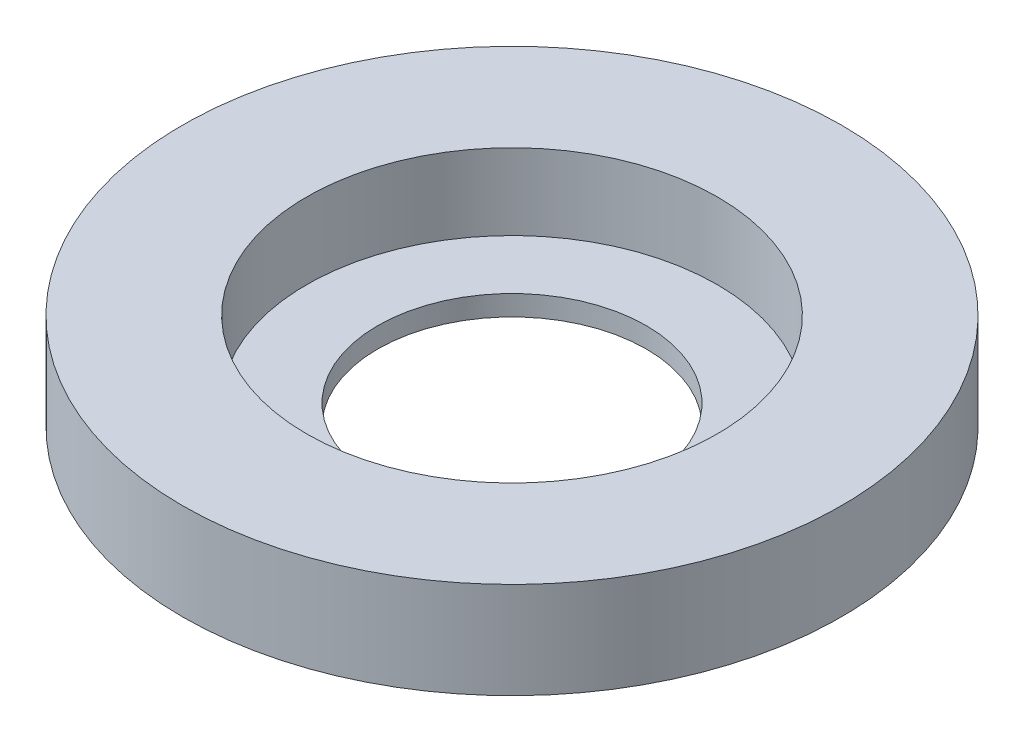
ISO-10303-21;
HEADER;
FILE_DESCRIPTION(('STEP AP214'),'2;1');
FILE_NAME('part.step','',(''),(''),'','','');
FILE_SCHEMA(('AUTOMOTIVE_DESIGN { 1 0 10303 214 1 1 1 1 }'));
ENDSEC;
DATA;
#1=APPLICATION_CONTEXT('core data for automotive mechanical design processes');
#2=APPLICATION_PROTOCOL_DEFINITION('international standard','automotive_design',2000,#1);
#3=PRODUCT_CONTEXT('',#1,'mechanical');
#4=PRODUCT('Part','Part','',(#3));
#5=PRODUCT_RELATED_PRODUCT_CATEGORY('part','',(#4));
#6=PRODUCT_DEFINITION_FORMATION('','',#4);
#7=PRODUCT_DEFINITION_CONTEXT('part definition',#1,'design');
#8=PRODUCT_DEFINITION('design','',#6,#7);
#9=PRODUCT_DEFINITION_SHAPE('','',#8);
#10=(LENGTH_UNIT() NAMED_UNIT(*) SI_UNIT(.MILLI.,.METRE.));
#11=(NAMED_UNIT(*) PLANE_ANGLE_UNIT() SI_UNIT($,.RADIAN.));
#12=(NAMED_UNIT(*) SI_UNIT($,.STERADIAN.) SOLID_ANGLE_UNIT());
#13=UNCERTAINTY_MEASURE_WITH_UNIT(LENGTH_MEASURE(1.E-05),#10,'distance_accuracy_value','');
#14=(GEOMETRIC_REPRESENTATION_CONTEXT(3) GLOBAL_UNCERTAINTY_ASSIGNED_CONTEXT((#13)) GLOBAL_UNIT_ASSIGNED_CONTEXT((#10,
#11,#12)) REPRESENTATION_CONTEXT('',''));
#15=CARTESIAN_POINT('',(0.,0.,0.));
#16=DIRECTION('',(0.,0.,1.));
#17=DIRECTION('',(1.,0.,0.));
#18=AXIS2_PLACEMENT_3D('',#15,#16,#17);
#19=CARTESIAN_POINT('',(0.,0.,0.));
#20=DIRECTION('',(0.,-1.,0.));
#21=DIRECTION('',(0.,0.,-1.));
#22=AXIS2_PLACEMENT_3D('',#19,#20,#21);
#23=CYLINDRICAL_SURFACE('',#22,5.3);
#24=CARTESIAN_POINT('',(0.,0.,0.));
#25=DIRECTION('',(0.,-1.,0.));
#26=DIRECTION('',(0.,0.,-1.));
#27=AXIS2_PLACEMENT_3D('',#24,#25,#26);
#28=CIRCLE('',#27,5.3);
#29=CARTESIAN_POINT('',(0.,0.,-5.3));
#30=VERTEX_POINT('',#29);
#31=EDGE_CURVE('E10',#30,#30,#28,.T.);
#32=ORIENTED_EDGE('',*,*,#31,.T.);
#33=EDGE_LOOP('',(#32));
#34=FACE_BOUND('',#33,.T.);
#35=CARTESIAN_POINT('',(0.,0.8,0.));
#36=DIRECTION('',(0.,-1.,0.));
#37=DIRECTION('',(0.,0.,-1.));
#38=AXIS2_PLACEMENT_3D('',#35,#36,#37);
#39=CIRCLE('',#38,5.3);
#40=CARTESIAN_POINT('',(0.,0.8,-5.3));
#41=VERTEX_POINT('',#40);
#42=EDGE_CURVE('E59',#41,#41,#39,.T.);
#43=ORIENTED_EDGE('',*,*,#42,.F.);
#44=EDGE_LOOP('',(#43));
#45=FACE_BOUND('',#44,.T.);
#46=ADVANCED_FACE('F37',(#34,#45),#23,.F.);
#47=CARTESIAN_POINT('',(5.3,0.,0.));
#48=DIRECTION('',(0.,-1.,0.));
#49=DIRECTION('',(0.,0.,-1.));
#50=AXIS2_PLACEMENT_3D('',#47,#48,#49);
#51=PLANE('',#50);
#52=CARTESIAN_POINT('',(0.,0.,0.));
#53=DIRECTION('',(0.,-1.,0.));
#54=DIRECTION('',(0.,0.,-1.));
#55=AXIS2_PLACEMENT_3D('',#52,#53,#54);
#56=CIRCLE('',#55,13.);
#57=CARTESIAN_POINT('',(0.,0.,-13.));
#58=VERTEX_POINT('',#57);
#59=EDGE_CURVE('E43',#58,#58,#56,.T.);
#60=ORIENTED_EDGE('',*,*,#59,.T.);
#61=EDGE_LOOP('',(#60));
#62=FACE_BOUND('',#61,.T.);
#63=ORIENTED_EDGE('',*,*,#31,.F.);
#64=EDGE_LOOP('',(#63));
#65=FACE_BOUND('',#64,.T.);
#66=ADVANCED_FACE('F67',(#62,#65),#51,.T.);
#67=CARTESIAN_POINT('',(0.,0.,0.));
#68=DIRECTION('',(0.,-1.,0.));
#69=DIRECTION('',(0.,0.,-1.));
#70=AXIS2_PLACEMENT_3D('',#67,#68,#69);
#71=CYLINDRICAL_SURFACE('',#70,13.);
#72=CARTESIAN_POINT('',(0.,3.8,0.));
#73=DIRECTION('',(0.,-1.,0.));
#74=DIRECTION('',(0.,0.,-1.));
#75=AXIS2_PLACEMENT_3D('',#72,#73,#74);
#76=CIRCLE('',#75,13.);
#77=CARTESIAN_POINT('',(0.,3.8,-13.));
#78=VERTEX_POINT('',#77);
#79=EDGE_CURVE('E47',#78,#78,#76,.T.);
#80=ORIENTED_EDGE('',*,*,#79,.T.);
#81=EDGE_LOOP('',(#80));
#82=FACE_BOUND('',#81,.T.);
#83=ORIENTED_EDGE('',*,*,#59,.F.);
#84=EDGE_LOOP('',(#83));
#85=FACE_BOUND('',#84,.T.);
#86=ADVANCED_FACE('F71',(#82,#85),#71,.T.);
#87=CARTESIAN_POINT('',(13.,3.8,0.));
#88=DIRECTION('',(0.,1.,0.));
#89=DIRECTION('',(0.,0.,1.));
#90=AXIS2_PLACEMENT_3D('',#87,#88,#89);
#91=PLANE('',#90);
#92=CARTESIAN_POINT('',(0.,3.8,0.));
#93=DIRECTION('',(0.,-1.,0.));
#94=DIRECTION('',(0.,0.,-1.));
#95=AXIS2_PLACEMENT_3D('',#92,#93,#94);
#96=CIRCLE('',#95,8.1);
#97=CARTESIAN_POINT('',(0.,3.8,-8.1));
#98=VERTEX_POINT('',#97);
#99=EDGE_CURVE('E51',#98,#98,#96,.T.);
#100=ORIENTED_EDGE('',*,*,#99,.T.);
#101=EDGE_LOOP('',(#100));
#102=FACE_BOUND('',#101,.T.);
#103=ORIENTED_EDGE('',*,*,#79,.F.);
#104=EDGE_LOOP('',(#103));
#105=FACE_BOUND('',#104,.T.);
#106=ADVANCED_FACE('F75',(#102,#105),#91,.T.);
#107=CARTESIAN_POINT('',(0.,0.,0.));
#108=DIRECTION('',(0.,-1.,0.));
#109=DIRECTION('',(0.,0.,-1.));
#110=AXIS2_PLACEMENT_3D('',#107,#108,#109);
#111=CYLINDRICAL_SURFACE('',#110,8.1);
#112=CARTESIAN_POINT('',(0.,0.8,0.));
#113=DIRECTION('',(0.,-1.,0.));
#114=DIRECTION('',(0.,0.,-1.));
#115=AXIS2_PLACEMENT_3D('',#112,#113,#114);
#116=CIRCLE('',#115,8.1);
#117=CARTESIAN_POINT('',(0.,0.8,-8.1));
#118=VERTEX_POINT('',#117);
#119=EDGE_CURVE('E56',#118,#118,#116,.T.);
#120=ORIENTED_EDGE('',*,*,#119,.T.);
#121=EDGE_LOOP('',(#120));
#122=FACE_BOUND('',#121,.T.);
#123=ORIENTED_EDGE('',*,*,#99,.F.);
#124=EDGE_LOOP('',(#123));
#125=FACE_BOUND('',#124,.T.);
#126=ADVANCED_FACE('F82',(#122,#125),#111,.F.);
#127=CARTESIAN_POINT('',(8.1,0.8,0.));
#128=DIRECTION('',(0.,1.,0.));
#129=DIRECTION('',(0.,0.,1.));
#130=AXIS2_PLACEMENT_3D('',#127,#128,#129);
#131=PLANE('',#130);
#132=ORIENTED_EDGE('',*,*,#42,.T.);
#133=EDGE_LOOP('',(#132));
#134=FACE_BOUND('',#133,.T.);
#135=ORIENTED_EDGE('',*,*,#119,.F.);
#136=EDGE_LOOP('',(#135));
#137=FACE_BOUND('',#136,.T.);
#138=ADVANCED_FACE('F63',(#134,#137),#131,.T.);
#139=CLOSED_SHELL('',(#46,#66,#86,#106,#126,#138));
#140=MANIFOLD_SOLID_BREP('B2',#139);
#141=ADVANCED_BREP_SHAPE_REPRESENTATION('',(#18,#140),#14);
#142=SHAPE_DEFINITION_REPRESENTATION(#9,#141);
ENDSEC;
END-ISO-10303-21;
